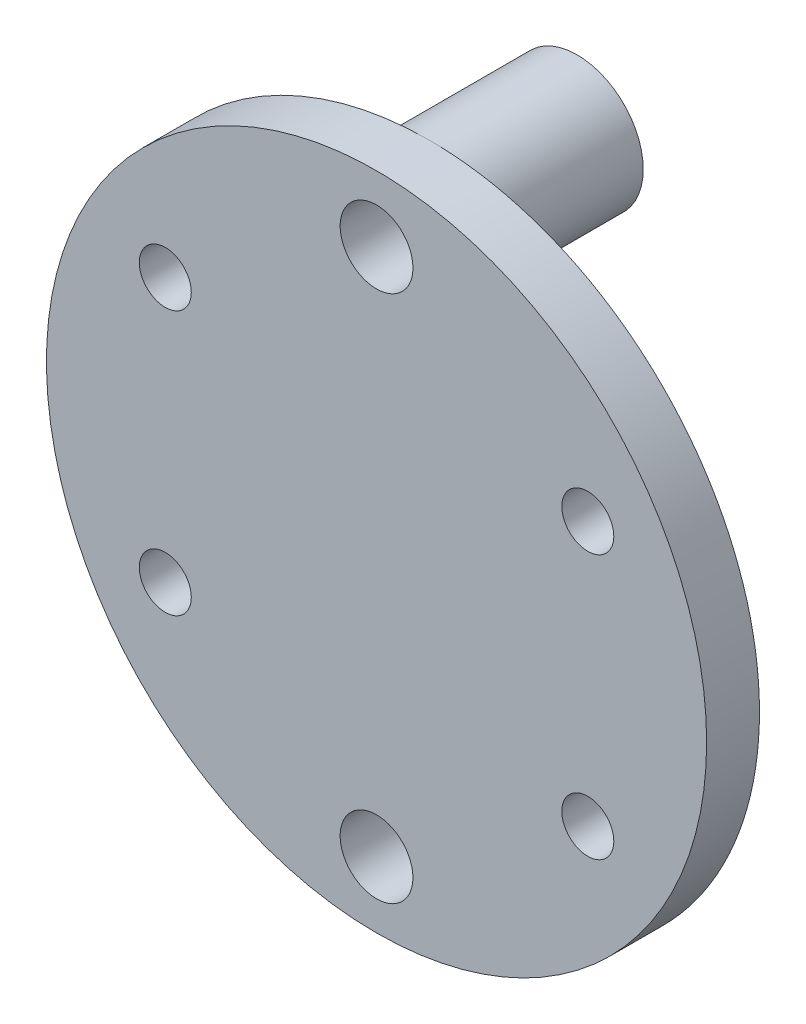
ISO-10303-21;
HEADER;
FILE_DESCRIPTION(('STEP AP214'),'2;1');
FILE_NAME('part.step','',(''),(''),'','','');
FILE_SCHEMA(('AUTOMOTIVE_DESIGN { 1 0 10303 214 1 1 1 1 }'));
ENDSEC;
DATA;
#1=APPLICATION_CONTEXT('core data for automotive mechanical design processes');
#2=APPLICATION_PROTOCOL_DEFINITION('international standard','automotive_design',2000,#1);
#3=PRODUCT_CONTEXT('',#1,'mechanical');
#4=PRODUCT('Part','Part','',(#3));
#5=PRODUCT_RELATED_PRODUCT_CATEGORY('part','',(#4));
#6=PRODUCT_DEFINITION_FORMATION('','',#4);
#7=PRODUCT_DEFINITION_CONTEXT('part definition',#1,'design');
#8=PRODUCT_DEFINITION('design','',#6,#7);
#9=PRODUCT_DEFINITION_SHAPE('','',#8);
#10=(LENGTH_UNIT() NAMED_UNIT(*) SI_UNIT(.MILLI.,.METRE.));
#11=(NAMED_UNIT(*) PLANE_ANGLE_UNIT() SI_UNIT($,.RADIAN.));
#12=(NAMED_UNIT(*) SI_UNIT($,.STERADIAN.) SOLID_ANGLE_UNIT());
#13=UNCERTAINTY_MEASURE_WITH_UNIT(LENGTH_MEASURE(1.E-05),#10,'distance_accuracy_value','');
#14=(GEOMETRIC_REPRESENTATION_CONTEXT(3) GLOBAL_UNCERTAINTY_ASSIGNED_CONTEXT((#13)) GLOBAL_UNIT_ASSIGNED_CONTEXT((#10,
#11,#12)) REPRESENTATION_CONTEXT('',''));
#15=CARTESIAN_POINT('',(0.,0.,0.));
#16=DIRECTION('',(0.,0.,1.));
#17=DIRECTION('',(1.,0.,0.));
#18=AXIS2_PLACEMENT_3D('',#15,#16,#17);
#19=CARTESIAN_POINT('',(0.,0.,0.));
#20=DIRECTION('',(0.,0.,1.));
#21=DIRECTION('',(1.,0.,0.));
#22=AXIS2_PLACEMENT_3D('',#19,#20,#21);
#23=PLANE('',#22);
#24=CARTESIAN_POINT('',(-10.16,-6.35,0.));
#25=DIRECTION('',(0.,0.,1.));
#26=DIRECTION('',(1.,0.,0.));
#27=AXIS2_PLACEMENT_3D('',#24,#25,#26);
#28=CIRCLE('',#27,1.25);
#29=CARTESIAN_POINT('',(-8.91,-6.35,0.));
#30=VERTEX_POINT('',#29);
#31=EDGE_CURVE('E47',#30,#30,#28,.F.);
#32=ORIENTED_EDGE('',*,*,#31,.F.);
#33=EDGE_LOOP('',(#32));
#34=FACE_BOUND('',#33,.T.);
#35=CARTESIAN_POINT('',(10.16,-6.35,0.));
#36=DIRECTION('',(0.,0.,1.));
#37=DIRECTION('',(1.,0.,0.));
#38=AXIS2_PLACEMENT_3D('',#35,#36,#37);
#39=CIRCLE('',#38,1.25);
#40=CARTESIAN_POINT('',(11.41,-6.35,0.));
#41=VERTEX_POINT('',#40);
#42=EDGE_CURVE('E71',#41,#41,#39,.T.);
#43=ORIENTED_EDGE('',*,*,#42,.T.);
#44=EDGE_LOOP('',(#43));
#45=FACE_BOUND('',#44,.T.);
#46=CARTESIAN_POINT('',(-10.16,6.35,0.));
#47=DIRECTION('',(0.,0.,1.));
#48=DIRECTION('',(1.,0.,0.));
#49=AXIS2_PLACEMENT_3D('',#46,#47,#48);
#50=CIRCLE('',#49,1.25);
#51=CARTESIAN_POINT('',(-8.91,6.35,0.));
#52=VERTEX_POINT('',#51);
#53=EDGE_CURVE('E79',#52,#52,#50,.T.);
#54=ORIENTED_EDGE('',*,*,#53,.T.);
#55=EDGE_LOOP('',(#54));
#56=FACE_BOUND('',#55,.T.);
#57=CARTESIAN_POINT('',(10.16,6.35,0.));
#58=DIRECTION('',(0.,0.,1.));
#59=DIRECTION('',(1.,0.,0.));
#60=AXIS2_PLACEMENT_3D('',#57,#58,#59);
#61=CIRCLE('',#60,1.25);
#62=CARTESIAN_POINT('',(11.41,6.35,0.));
#63=VERTEX_POINT('',#62);
#64=EDGE_CURVE('E82',#63,#63,#61,.F.);
#65=ORIENTED_EDGE('',*,*,#64,.F.);
#66=EDGE_LOOP('',(#65));
#67=FACE_BOUND('',#66,.T.);
#68=CARTESIAN_POINT('',(0.,0.,0.));
#69=DIRECTION('',(0.,0.,1.));
#70=DIRECTION('',(1.,0.,0.));
#71=AXIS2_PLACEMENT_3D('',#68,#69,#70);
#72=CIRCLE('',#71,15.875);
#73=CARTESIAN_POINT('',(0.,15.875,0.));
#74=VERTEX_POINT('',#73);
#75=CARTESIAN_POINT('',(0.,-15.875,0.));
#76=VERTEX_POINT('',#75);
#77=EDGE_CURVE('E67',#74,#76,#72,.T.);
#78=ORIENTED_EDGE('',*,*,#77,.F.);
#79=CARTESIAN_POINT('',(0.,12.7,0.));
#80=DIRECTION('',(0.,0.,1.));
#81=DIRECTION('',(1.,0.,0.));
#82=AXIS2_PLACEMENT_3D('',#79,#80,#81);
#83=CIRCLE('',#82,3.175);
#84=EDGE_CURVE('E62',#74,#74,#83,.T.);
#85=ORIENTED_EDGE('',*,*,#84,.T.);
#86=EDGE_CURVE('E66',#76,#74,#72,.T.);
#87=ORIENTED_EDGE('',*,*,#86,.F.);
#88=CARTESIAN_POINT('',(0.,-12.7,0.));
#89=DIRECTION('',(0.,0.,1.));
#90=DIRECTION('',(1.,0.,0.));
#91=AXIS2_PLACEMENT_3D('',#88,#89,#90);
#92=CIRCLE('',#91,3.175);
#93=EDGE_CURVE('E77',#76,#76,#92,.F.);
#94=ORIENTED_EDGE('',*,*,#93,.F.);
#95=EDGE_LOOP('',(#78,#85,#87,#94));
#96=FACE_BOUND('',#95,.T.);
#97=ADVANCED_FACE('F44',(#34,#45,#56,#67,#96),#23,.F.);
#98=CARTESIAN_POINT('',(0.,12.7,2.54));
#99=DIRECTION('',(0.,0.,-1.));
#100=DIRECTION('',(-1.,0.,0.));
#101=AXIS2_PLACEMENT_3D('',#98,#99,#100);
#102=CYLINDRICAL_SURFACE('',#101,1.75);
#103=CARTESIAN_POINT('',(0.,12.7,2.54));
#104=DIRECTION('',(0.,0.,1.));
#105=DIRECTION('',(1.,0.,0.));
#106=AXIS2_PLACEMENT_3D('',#103,#104,#105);
#107=CIRCLE('',#106,1.75);
#108=CARTESIAN_POINT('',(1.75,12.7,2.54));
#109=VERTEX_POINT('',#108);
#110=EDGE_CURVE('E54',#109,#109,#107,.T.);
#111=ORIENTED_EDGE('',*,*,#110,.T.);
#112=EDGE_LOOP('',(#111));
#113=FACE_BOUND('',#112,.T.);
#114=CARTESIAN_POINT('',(0.,12.7,-7.110000004));
#115=DIRECTION('',(0.,0.,1.));
#116=DIRECTION('',(1.,0.,0.));
#117=AXIS2_PLACEMENT_3D('',#114,#115,#116);
#118=CIRCLE('',#117,1.75);
#119=CARTESIAN_POINT('',(1.75,12.7,-7.110000004));
#120=VERTEX_POINT('',#119);
#121=EDGE_CURVE('E127',#120,#120,#118,.T.);
#122=ORIENTED_EDGE('',*,*,#121,.F.);
#123=EDGE_LOOP('',(#122));
#124=FACE_BOUND('',#123,.T.);
#125=ADVANCED_FACE('F165',(#113,#124),#102,.F.);
#126=CARTESIAN_POINT('',(-10.16,-6.35,2.54));
#127=DIRECTION('',(0.,0.,-1.));
#128=DIRECTION('',(-1.,0.,0.));
#129=AXIS2_PLACEMENT_3D('',#126,#127,#128);
#130=CYLINDRICAL_SURFACE('',#129,1.25);
#131=CARTESIAN_POINT('',(-10.16,-6.35,2.54));
#132=DIRECTION('',(0.,0.,1.));
#133=DIRECTION('',(1.,0.,0.));
#134=AXIS2_PLACEMENT_3D('',#131,#132,#133);
#135=CIRCLE('',#134,1.25);
#136=CARTESIAN_POINT('',(-8.91,-6.35,2.54));
#137=VERTEX_POINT('',#136);
#138=EDGE_CURVE('E114',#137,#137,#135,.F.);
#139=ORIENTED_EDGE('',*,*,#138,.F.);
#140=EDGE_LOOP('',(#139));
#141=FACE_BOUND('',#140,.T.);
#142=ORIENTED_EDGE('',*,*,#31,.T.);
#143=EDGE_LOOP('',(#142));
#144=FACE_BOUND('',#143,.T.);
#145=ADVANCED_FACE('F166',(#141,#144),#130,.F.);
#146=CARTESIAN_POINT('',(10.16,-6.35,2.54));
#147=DIRECTION('',(0.,0.,-1.));
#148=DIRECTION('',(-1.,0.,0.));
#149=AXIS2_PLACEMENT_3D('',#146,#147,#148);
#150=CYLINDRICAL_SURFACE('',#149,1.25);
#151=CARTESIAN_POINT('',(10.16,-6.35,2.54));
#152=DIRECTION('',(0.,0.,1.));
#153=DIRECTION('',(1.,0.,0.));
#154=AXIS2_PLACEMENT_3D('',#151,#152,#153);
#155=CIRCLE('',#154,1.25);
#156=CARTESIAN_POINT('',(11.41,-6.35,2.54));
#157=VERTEX_POINT('',#156);
#158=EDGE_CURVE('E108',#157,#157,#155,.T.);
#159=ORIENTED_EDGE('',*,*,#158,.T.);
#160=EDGE_LOOP('',(#159));
#161=FACE_BOUND('',#160,.T.);
#162=ORIENTED_EDGE('',*,*,#42,.F.);
#163=EDGE_LOOP('',(#162));
#164=FACE_BOUND('',#163,.T.);
#165=ADVANCED_FACE('F176',(#161,#164),#150,.F.);
#166=CARTESIAN_POINT('',(0.,0.,2.54));
#167=DIRECTION('',(0.,0.,-1.));
#168=DIRECTION('',(-1.,0.,0.));
#169=AXIS2_PLACEMENT_3D('',#166,#167,#168);
#170=CYLINDRICAL_SURFACE('',#169,15.875);
#171=CARTESIAN_POINT('',(0.,0.,2.54));
#172=DIRECTION('',(0.,0.,1.));
#173=DIRECTION('',(1.,0.,0.));
#174=AXIS2_PLACEMENT_3D('',#171,#172,#173);
#175=CIRCLE('',#174,15.875);
#176=CARTESIAN_POINT('',(15.875,0.,2.54));
#177=VERTEX_POINT('',#176);
#178=EDGE_CURVE('E101',#177,#177,#175,.T.);
#179=ORIENTED_EDGE('',*,*,#178,.F.);
#180=EDGE_LOOP('',(#179));
#181=FACE_BOUND('',#180,.T.);
#182=ORIENTED_EDGE('',*,*,#77,.T.);
#183=ORIENTED_EDGE('',*,*,#86,.T.);
#184=EDGE_LOOP('',(#182,#183));
#185=FACE_BOUND('',#184,.T.);
#186=ADVANCED_FACE('F69',(#181,#185),#170,.T.);
#187=CARTESIAN_POINT('',(-10.16,6.35,2.54));
#188=DIRECTION('',(0.,0.,-1.));
#189=DIRECTION('',(-1.,0.,0.));
#190=AXIS2_PLACEMENT_3D('',#187,#188,#189);
#191=CYLINDRICAL_SURFACE('',#190,1.25);
#192=CARTESIAN_POINT('',(-10.16,6.35,2.54));
#193=DIRECTION('',(0.,0.,1.));
#194=DIRECTION('',(1.,0.,0.));
#195=AXIS2_PLACEMENT_3D('',#192,#193,#194);
#196=CIRCLE('',#195,1.25);
#197=CARTESIAN_POINT('',(-8.91,6.35,2.54));
#198=VERTEX_POINT('',#197);
#199=EDGE_CURVE('E92',#198,#198,#196,.T.);
#200=ORIENTED_EDGE('',*,*,#199,.T.);
#201=EDGE_LOOP('',(#200));
#202=FACE_BOUND('',#201,.T.);
#203=ORIENTED_EDGE('',*,*,#53,.F.);
#204=EDGE_LOOP('',(#203));
#205=FACE_BOUND('',#204,.T.);
#206=ADVANCED_FACE('F183',(#202,#205),#191,.F.);
#207=CARTESIAN_POINT('',(10.16,6.35,2.54));
#208=DIRECTION('',(0.,0.,-1.));
#209=DIRECTION('',(-1.,0.,0.));
#210=AXIS2_PLACEMENT_3D('',#207,#208,#209);
#211=CYLINDRICAL_SURFACE('',#210,1.25);
#212=CARTESIAN_POINT('',(10.16,6.35,2.54));
#213=DIRECTION('',(0.,0.,1.));
#214=DIRECTION('',(1.,0.,0.));
#215=AXIS2_PLACEMENT_3D('',#212,#213,#214);
#216=CIRCLE('',#215,1.25);
#217=CARTESIAN_POINT('',(11.41,6.35,2.54));
#218=VERTEX_POINT('',#217);
#219=EDGE_CURVE('E89',#218,#218,#216,.F.);
#220=ORIENTED_EDGE('',*,*,#219,.F.);
#221=EDGE_LOOP('',(#220));
#222=FACE_BOUND('',#221,.T.);
#223=ORIENTED_EDGE('',*,*,#64,.T.);
#224=EDGE_LOOP('',(#223));
#225=FACE_BOUND('',#224,.T.);
#226=ADVANCED_FACE('F50',(#222,#225),#211,.F.);
#227=CARTESIAN_POINT('',(0.,-12.7,2.54));
#228=DIRECTION('',(0.,0.,-1.));
#229=DIRECTION('',(-1.,0.,0.));
#230=AXIS2_PLACEMENT_3D('',#227,#228,#229);
#231=CYLINDRICAL_SURFACE('',#230,1.75);
#232=CARTESIAN_POINT('',(0.,-12.7,2.54));
#233=DIRECTION('',(0.,0.,1.));
#234=DIRECTION('',(1.,0.,0.));
#235=AXIS2_PLACEMENT_3D('',#232,#233,#234);
#236=CIRCLE('',#235,1.75);
#237=CARTESIAN_POINT('',(1.75,-12.7,2.54));
#238=VERTEX_POINT('',#237);
#239=EDGE_CURVE('E11',#238,#238,#236,.F.);
#240=ORIENTED_EDGE('',*,*,#239,.F.);
#241=EDGE_LOOP('',(#240));
#242=FACE_BOUND('',#241,.T.);
#243=CARTESIAN_POINT('',(0.,-12.7,-7.110000004));
#244=DIRECTION('',(0.,0.,1.));
#245=DIRECTION('',(1.,0.,0.));
#246=AXIS2_PLACEMENT_3D('',#243,#244,#245);
#247=CIRCLE('',#246,1.75);
#248=CARTESIAN_POINT('',(1.75,-12.7,-7.110000004));
#249=VERTEX_POINT('',#248);
#250=EDGE_CURVE('E137',#249,#249,#247,.F.);
#251=ORIENTED_EDGE('',*,*,#250,.T.);
#252=EDGE_LOOP('',(#251));
#253=FACE_BOUND('',#252,.T.);
#254=ADVANCED_FACE('F145',(#242,#253),#231,.F.);
#255=CARTESIAN_POINT('',(0.,0.,2.54));
#256=DIRECTION('',(0.,0.,1.));
#257=DIRECTION('',(1.,0.,0.));
#258=AXIS2_PLACEMENT_3D('',#255,#256,#257);
#259=PLANE('',#258);
#260=ORIENTED_EDGE('',*,*,#219,.T.);
#261=EDGE_LOOP('',(#260));
#262=FACE_BOUND('',#261,.T.);
#263=ORIENTED_EDGE('',*,*,#199,.F.);
#264=EDGE_LOOP('',(#263));
#265=FACE_BOUND('',#264,.T.);
#266=ORIENTED_EDGE('',*,*,#178,.T.);
#267=EDGE_LOOP('',(#266));
#268=FACE_BOUND('',#267,.T.);
#269=ORIENTED_EDGE('',*,*,#158,.F.);
#270=EDGE_LOOP('',(#269));
#271=FACE_BOUND('',#270,.T.);
#272=ORIENTED_EDGE('',*,*,#138,.T.);
#273=EDGE_LOOP('',(#272));
#274=FACE_BOUND('',#273,.T.);
#275=ORIENTED_EDGE('',*,*,#110,.F.);
#276=EDGE_LOOP('',(#275));
#277=FACE_BOUND('',#276,.T.);
#278=ORIENTED_EDGE('',*,*,#239,.T.);
#279=EDGE_LOOP('',(#278));
#280=FACE_BOUND('',#279,.T.);
#281=ADVANCED_FACE('F158',(#262,#265,#268,#271,#274,#277,#280),#259,.T.);
#282=CARTESIAN_POINT('',(0.,-12.7,-7.110000004));
#283=DIRECTION('',(0.,0.,1.));
#284=DIRECTION('',(1.,0.,0.));
#285=AXIS2_PLACEMENT_3D('',#282,#283,#284);
#286=CYLINDRICAL_SURFACE('',#285,3.175);
#287=CARTESIAN_POINT('',(0.,-12.7,-7.110000004));
#288=DIRECTION('',(0.,0.,1.));
#289=DIRECTION('',(1.,0.,0.));
#290=AXIS2_PLACEMENT_3D('',#287,#288,#289);
#291=CIRCLE('',#290,3.175);
#292=CARTESIAN_POINT('',(3.175,-12.7,-7.110000004));
#293=VERTEX_POINT('',#292);
#294=EDGE_CURVE('E140',#293,#293,#291,.F.);
#295=ORIENTED_EDGE('',*,*,#294,.F.);
#296=EDGE_LOOP('',(#295));
#297=FACE_BOUND('',#296,.T.);
#298=ORIENTED_EDGE('',*,*,#93,.T.);
#299=EDGE_LOOP('',(#298));
#300=FACE_BOUND('',#299,.T.);
#301=ADVANCED_FACE('F149',(#297,#300),#286,.T.);
#302=CARTESIAN_POINT('',(0.,0.,-7.110000004));
#303=DIRECTION('',(0.,0.,1.));
#304=DIRECTION('',(1.,0.,0.));
#305=AXIS2_PLACEMENT_3D('',#302,#303,#304);
#306=PLANE('',#305);
#307=ORIENTED_EDGE('',*,*,#294,.T.);
#308=EDGE_LOOP('',(#307));
#309=FACE_BOUND('',#308,.T.);
#310=ORIENTED_EDGE('',*,*,#250,.F.);
#311=EDGE_LOOP('',(#310));
#312=FACE_BOUND('',#311,.T.);
#313=ADVANCED_FACE('F148',(#309,#312),#306,.F.);
#314=CARTESIAN_POINT('',(0.,12.7,-7.110000004));
#315=DIRECTION('',(0.,0.,1.));
#316=DIRECTION('',(1.,0.,0.));
#317=AXIS2_PLACEMENT_3D('',#314,#315,#316);
#318=CYLINDRICAL_SURFACE('',#317,3.175);
#319=CARTESIAN_POINT('',(0.,12.7,-7.110000004));
#320=DIRECTION('',(0.,0.,1.));
#321=DIRECTION('',(1.,0.,0.));
#322=AXIS2_PLACEMENT_3D('',#319,#320,#321);
#323=CIRCLE('',#322,3.175);
#324=CARTESIAN_POINT('',(3.175,12.7,-7.110000004));
#325=VERTEX_POINT('',#324);
#326=EDGE_CURVE('E122',#325,#325,#323,.T.);
#327=ORIENTED_EDGE('',*,*,#326,.T.);
#328=EDGE_LOOP('',(#327));
#329=FACE_BOUND('',#328,.T.);
#330=ORIENTED_EDGE('',*,*,#84,.F.);
#331=EDGE_LOOP('',(#330));
#332=FACE_BOUND('',#331,.T.);
#333=ADVANCED_FACE('F146',(#329,#332),#318,.T.);
#334=CARTESIAN_POINT('',(0.,0.,-7.110000004));
#335=DIRECTION('',(0.,0.,1.));
#336=DIRECTION('',(1.,0.,0.));
#337=AXIS2_PLACEMENT_3D('',#334,#335,#336);
#338=PLANE('',#337);
#339=ORIENTED_EDGE('',*,*,#121,.T.);
#340=EDGE_LOOP('',(#339));
#341=FACE_BOUND('',#340,.T.);
#342=ORIENTED_EDGE('',*,*,#326,.F.);
#343=EDGE_LOOP('',(#342));
#344=FACE_BOUND('',#343,.T.);
#345=ADVANCED_FACE('F156',(#341,#344),#338,.F.);
#346=CLOSED_SHELL('',(#97,#125,#145,#165,#186,#206,#226,#254,#281,#301,#313,#333,#345));
#347=MANIFOLD_SOLID_BREP('B2',#346);
#348=ADVANCED_BREP_SHAPE_REPRESENTATION('',(#18,#347),#14);
#349=SHAPE_DEFINITION_REPRESENTATION(#9,#348);
ENDSEC;
END-ISO-10303-21;
